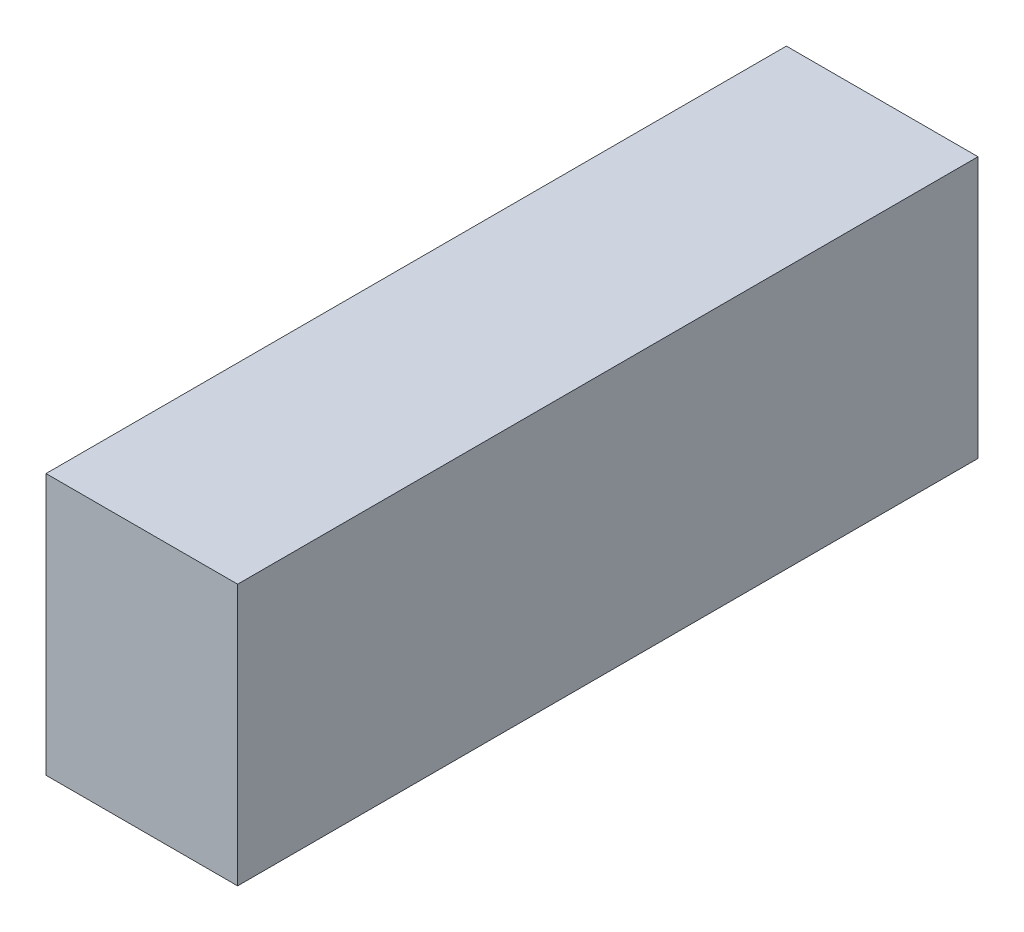
ISO-10303-21;
HEADER;
FILE_DESCRIPTION(('STEP AP214'),'2;1');
FILE_NAME('part.step','',(''),(''),'','','');
FILE_SCHEMA(('AUTOMOTIVE_DESIGN { 1 0 10303 214 1 1 1 1 }'));
ENDSEC;
DATA;
#1=APPLICATION_CONTEXT('core data for automotive mechanical design processes');
#2=APPLICATION_PROTOCOL_DEFINITION('international standard','automotive_design',2000,#1);
#3=PRODUCT_CONTEXT('',#1,'mechanical');
#4=PRODUCT('Part','Part','',(#3));
#5=PRODUCT_RELATED_PRODUCT_CATEGORY('part','',(#4));
#6=PRODUCT_DEFINITION_FORMATION('','',#4);
#7=PRODUCT_DEFINITION_CONTEXT('part definition',#1,'design');
#8=PRODUCT_DEFINITION('design','',#6,#7);
#9=PRODUCT_DEFINITION_SHAPE('','',#8);
#10=(LENGTH_UNIT() NAMED_UNIT(*) SI_UNIT(.MILLI.,.METRE.));
#11=(NAMED_UNIT(*) PLANE_ANGLE_UNIT() SI_UNIT($,.RADIAN.));
#12=(NAMED_UNIT(*) SI_UNIT($,.STERADIAN.) SOLID_ANGLE_UNIT());
#13=UNCERTAINTY_MEASURE_WITH_UNIT(LENGTH_MEASURE(1.E-05),#10,'distance_accuracy_value','');
#14=(GEOMETRIC_REPRESENTATION_CONTEXT(3) GLOBAL_UNCERTAINTY_ASSIGNED_CONTEXT((#13)) GLOBAL_UNIT_ASSIGNED_CONTEXT((#10,
#11,#12)) REPRESENTATION_CONTEXT('',''));
#15=CARTESIAN_POINT('',(0.,0.,0.));
#16=DIRECTION('',(0.,0.,1.));
#17=DIRECTION('',(1.,0.,0.));
#18=AXIS2_PLACEMENT_3D('',#15,#16,#17);
#19=CARTESIAN_POINT('',(13.97,-19.05,31.75));
#20=DIRECTION('',(-1.,0.,0.));
#21=DIRECTION('',(0.,0.,1.));
#22=AXIS2_PLACEMENT_3D('',#19,#20,#21);
#23=PLANE('',#22);
#24=DIRECTION('',(0.,0.,-1.));
#25=VECTOR('',#24,1.);
#26=CARTESIAN_POINT('',(13.97,-19.05,31.75));
#27=LINE('',#26,#25);
#28=CARTESIAN_POINT('',(13.97,-19.05,31.75));
#29=VERTEX_POINT('',#28);
#30=CARTESIAN_POINT('',(13.97,-19.05,-76.2));
#31=VERTEX_POINT('',#30);
#32=EDGE_CURVE('E78',#29,#31,#27,.T.);
#33=ORIENTED_EDGE('',*,*,#32,.T.);
#34=DIRECTION('',(0.,-1.,0.));
#35=VECTOR('',#34,1.);
#36=CARTESIAN_POINT('',(13.97,19.05,-76.2));
#37=LINE('',#36,#35);
#38=CARTESIAN_POINT('',(13.97,19.05,-76.2));
#39=VERTEX_POINT('',#38);
#40=EDGE_CURVE('E82',#39,#31,#37,.T.);
#41=ORIENTED_EDGE('',*,*,#40,.F.);
#42=DIRECTION('',(0.,0.,-1.));
#43=VECTOR('',#42,1.);
#44=CARTESIAN_POINT('',(13.97,19.05,31.75));
#45=LINE('',#44,#43);
#46=CARTESIAN_POINT('',(13.97,19.05,31.75));
#47=VERTEX_POINT('',#46);
#48=EDGE_CURVE('E11',#47,#39,#45,.T.);
#49=ORIENTED_EDGE('',*,*,#48,.F.);
#50=DIRECTION('',(0.,1.,0.));
#51=VECTOR('',#50,1.);
#52=CARTESIAN_POINT('',(13.97,-19.05,31.75));
#53=LINE('',#52,#51);
#54=EDGE_CURVE('E83',#29,#47,#53,.T.);
#55=ORIENTED_EDGE('',*,*,#54,.F.);
#56=EDGE_LOOP('',(#33,#41,#49,#55));
#57=FACE_BOUND('',#56,.T.);
#58=ADVANCED_FACE('F39',(#57),#23,.F.);
#59=CARTESIAN_POINT('',(-13.97,19.05,31.75));
#60=DIRECTION('',(0.,-1.,0.));
#61=DIRECTION('',(0.,0.,-1.));
#62=AXIS2_PLACEMENT_3D('',#59,#60,#61);
#63=PLANE('',#62);
#64=ORIENTED_EDGE('',*,*,#48,.T.);
#65=DIRECTION('',(1.,0.,0.));
#66=VECTOR('',#65,1.);
#67=CARTESIAN_POINT('',(13.97,19.05,-76.2));
#68=LINE('',#67,#66);
#69=CARTESIAN_POINT('',(-13.97,19.05,-76.2));
#70=VERTEX_POINT('',#69);
#71=EDGE_CURVE('E98',#70,#39,#68,.T.);
#72=ORIENTED_EDGE('',*,*,#71,.F.);
#73=DIRECTION('',(0.,0.,-1.));
#74=VECTOR('',#73,1.);
#75=CARTESIAN_POINT('',(-13.97,19.05,31.75));
#76=LINE('',#75,#74);
#77=CARTESIAN_POINT('',(-13.97,19.05,31.75));
#78=VERTEX_POINT('',#77);
#79=EDGE_CURVE('E46',#78,#70,#76,.T.);
#80=ORIENTED_EDGE('',*,*,#79,.F.);
#81=DIRECTION('',(-1.,0.,0.));
#82=VECTOR('',#81,1.);
#83=CARTESIAN_POINT('',(-13.97,19.05,31.75));
#84=LINE('',#83,#82);
#85=EDGE_CURVE('E104',#47,#78,#84,.T.);
#86=ORIENTED_EDGE('',*,*,#85,.F.);
#87=EDGE_LOOP('',(#64,#72,#80,#86));
#88=FACE_BOUND('',#87,.T.);
#89=ADVANCED_FACE('F112',(#88),#63,.F.);
#90=CARTESIAN_POINT('',(-13.97,-19.05,31.75));
#91=DIRECTION('',(1.,0.,0.));
#92=DIRECTION('',(0.,0.,-1.));
#93=AXIS2_PLACEMENT_3D('',#90,#91,#92);
#94=PLANE('',#93);
#95=ORIENTED_EDGE('',*,*,#79,.T.);
#96=DIRECTION('',(0.,1.,0.));
#97=VECTOR('',#96,1.);
#98=CARTESIAN_POINT('',(-13.97,19.05,-76.2));
#99=LINE('',#98,#97);
#100=CARTESIAN_POINT('',(-13.97,-19.05,-76.2));
#101=VERTEX_POINT('',#100);
#102=EDGE_CURVE('E93',#101,#70,#99,.T.);
#103=ORIENTED_EDGE('',*,*,#102,.F.);
#104=DIRECTION('',(0.,0.,-1.));
#105=VECTOR('',#104,1.);
#106=CARTESIAN_POINT('',(-13.97,-19.05,31.75));
#107=LINE('',#106,#105);
#108=CARTESIAN_POINT('',(-13.97,-19.05,31.75));
#109=VERTEX_POINT('',#108);
#110=EDGE_CURVE('E85',#109,#101,#107,.T.);
#111=ORIENTED_EDGE('',*,*,#110,.F.);
#112=DIRECTION('',(0.,-1.,0.));
#113=VECTOR('',#112,1.);
#114=CARTESIAN_POINT('',(-13.97,-19.05,31.75));
#115=LINE('',#114,#113);
#116=EDGE_CURVE('E58',#78,#109,#115,.T.);
#117=ORIENTED_EDGE('',*,*,#116,.F.);
#118=EDGE_LOOP('',(#95,#103,#111,#117));
#119=FACE_BOUND('',#118,.T.);
#120=ADVANCED_FACE('F110',(#119),#94,.F.);
#121=CARTESIAN_POINT('',(-13.97,-19.05,31.75));
#122=DIRECTION('',(0.,1.,0.));
#123=DIRECTION('',(0.,0.,1.));
#124=AXIS2_PLACEMENT_3D('',#121,#122,#123);
#125=PLANE('',#124);
#126=ORIENTED_EDGE('',*,*,#110,.T.);
#127=DIRECTION('',(-1.,0.,0.));
#128=VECTOR('',#127,1.);
#129=CARTESIAN_POINT('',(13.97,-19.05,-76.2));
#130=LINE('',#129,#128);
#131=EDGE_CURVE('E88',#31,#101,#130,.T.);
#132=ORIENTED_EDGE('',*,*,#131,.F.);
#133=ORIENTED_EDGE('',*,*,#32,.F.);
#134=DIRECTION('',(1.,0.,0.));
#135=VECTOR('',#134,1.);
#136=CARTESIAN_POINT('',(-13.97,-19.05,31.75));
#137=LINE('',#136,#135);
#138=EDGE_CURVE('E53',#109,#29,#137,.T.);
#139=ORIENTED_EDGE('',*,*,#138,.F.);
#140=EDGE_LOOP('',(#126,#132,#133,#139));
#141=FACE_BOUND('',#140,.T.);
#142=ADVANCED_FACE('F89',(#141),#125,.F.);
#143=CARTESIAN_POINT('',(0.,0.,31.75));
#144=DIRECTION('',(0.,0.,-1.));
#145=DIRECTION('',(-1.,0.,0.));
#146=AXIS2_PLACEMENT_3D('',#143,#144,#145);
#147=PLANE('',#146);
#148=ORIENTED_EDGE('',*,*,#54,.T.);
#149=ORIENTED_EDGE('',*,*,#85,.T.);
#150=ORIENTED_EDGE('',*,*,#116,.T.);
#151=ORIENTED_EDGE('',*,*,#138,.T.);
#152=EDGE_LOOP('',(#148,#149,#150,#151));
#153=FACE_BOUND('',#152,.T.);
#154=ADVANCED_FACE('F113',(#153),#147,.F.);
#155=CARTESIAN_POINT('',(0.,0.,-76.2));
#156=DIRECTION('',(0.,0.,-1.));
#157=DIRECTION('',(-1.,0.,0.));
#158=AXIS2_PLACEMENT_3D('',#155,#156,#157);
#159=PLANE('',#158);
#160=ORIENTED_EDGE('',*,*,#40,.T.);
#161=ORIENTED_EDGE('',*,*,#131,.T.);
#162=ORIENTED_EDGE('',*,*,#102,.T.);
#163=ORIENTED_EDGE('',*,*,#71,.T.);
#164=EDGE_LOOP('',(#160,#161,#162,#163));
#165=FACE_BOUND('',#164,.T.);
#166=ADVANCED_FACE('F96',(#165),#159,.T.);
#167=CLOSED_SHELL('',(#58,#89,#120,#142,#154,#166));
#168=MANIFOLD_SOLID_BREP('B2',#167);
#169=ADVANCED_BREP_SHAPE_REPRESENTATION('',(#18,#168),#14);
#170=SHAPE_DEFINITION_REPRESENTATION(#9,#169);
ENDSEC;
END-ISO-10303-21;
